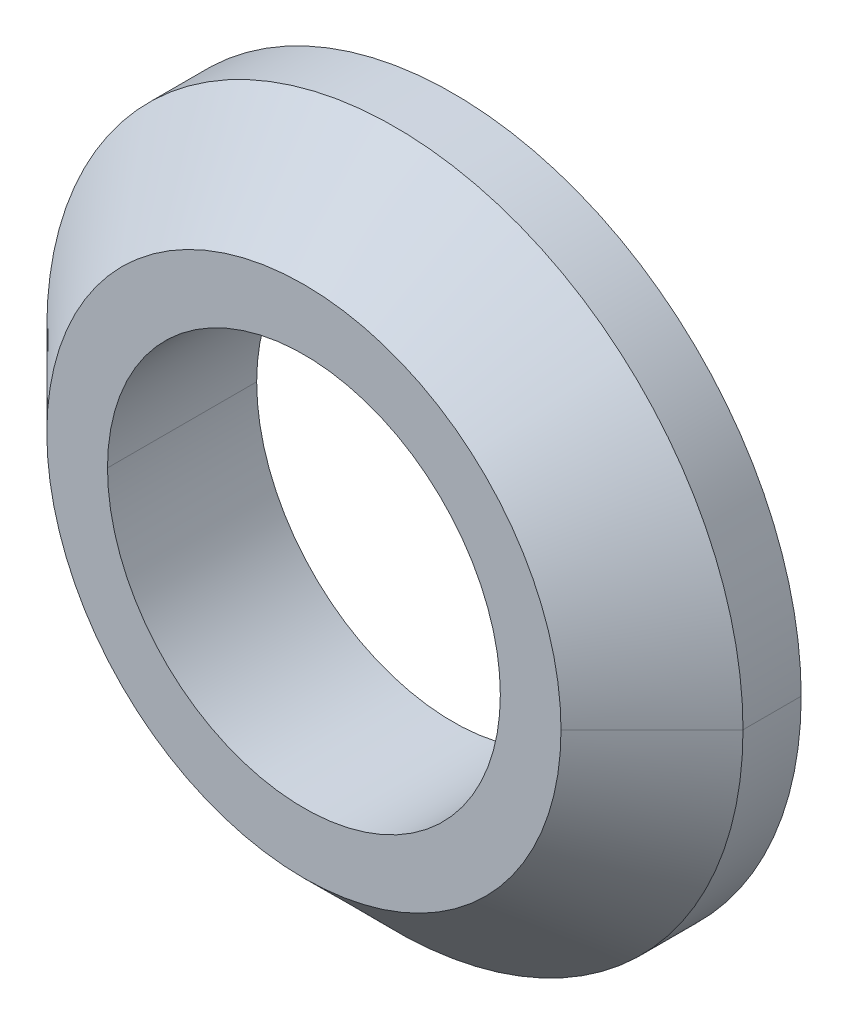
ISO-10303-21;
HEADER;
FILE_DESCRIPTION(('STEP AP214'),'2;1');
FILE_NAME('part.step','',(''),(''),'','','');
FILE_SCHEMA(('AUTOMOTIVE_DESIGN { 1 0 10303 214 1 1 1 1 }'));
ENDSEC;
DATA;
#1=APPLICATION_CONTEXT('core data for automotive mechanical design processes');
#2=APPLICATION_PROTOCOL_DEFINITION('international standard','automotive_design',2000,#1);
#3=PRODUCT_CONTEXT('',#1,'mechanical');
#4=PRODUCT('Part','Part','',(#3));
#5=PRODUCT_RELATED_PRODUCT_CATEGORY('part','',(#4));
#6=PRODUCT_DEFINITION_FORMATION('','',#4);
#7=PRODUCT_DEFINITION_CONTEXT('part definition',#1,'design');
#8=PRODUCT_DEFINITION('design','',#6,#7);
#9=PRODUCT_DEFINITION_SHAPE('','',#8);
#10=(LENGTH_UNIT() NAMED_UNIT(*) SI_UNIT(.MILLI.,.METRE.));
#11=(NAMED_UNIT(*) PLANE_ANGLE_UNIT() SI_UNIT($,.RADIAN.));
#12=(NAMED_UNIT(*) SI_UNIT($,.STERADIAN.) SOLID_ANGLE_UNIT());
#13=UNCERTAINTY_MEASURE_WITH_UNIT(LENGTH_MEASURE(1.E-05),#10,'distance_accuracy_value','');
#14=(GEOMETRIC_REPRESENTATION_CONTEXT(3) GLOBAL_UNCERTAINTY_ASSIGNED_CONTEXT((#13)) GLOBAL_UNIT_ASSIGNED_CONTEXT((#10,
#11,#12)) REPRESENTATION_CONTEXT('',''));
#15=CARTESIAN_POINT('',(0.,0.,0.));
#16=DIRECTION('',(0.,0.,1.));
#17=DIRECTION('',(1.,0.,0.));
#18=AXIS2_PLACEMENT_3D('',#15,#16,#17);
#19=CARTESIAN_POINT('',(0.,0.,0.));
#20=DIRECTION('',(0.,0.,-1.));
#21=DIRECTION('',(-1.,0.,0.));
#22=AXIS2_PLACEMENT_3D('',#19,#20,#21);
#23=CYLINDRICAL_SURFACE('',#22,3.5);
#24=CARTESIAN_POINT('',(0.,0.,0.585));
#25=DIRECTION('',(0.,0.,-1.));
#26=DIRECTION('',(-1.,0.,0.));
#27=AXIS2_PLACEMENT_3D('',#24,#25,#26);
#28=CIRCLE('',#27,3.5);
#29=CARTESIAN_POINT('',(-3.5,0.,0.585));
#30=VERTEX_POINT('',#29);
#31=CARTESIAN_POINT('',(3.5,0.,0.585));
#32=VERTEX_POINT('',#31);
#33=EDGE_CURVE('E11',#30,#32,#28,.T.);
#34=ORIENTED_EDGE('',*,*,#33,.T.);
#35=DIRECTION('',(0.,0.,-1.));
#36=VECTOR('',#35,1.);
#37=CARTESIAN_POINT('',(3.5,0.,0.));
#38=LINE('',#37,#36);
#39=CARTESIAN_POINT('',(3.5,0.,0.));
#40=VERTEX_POINT('',#39);
#41=EDGE_CURVE('E27',#32,#40,#38,.T.);
#42=ORIENTED_EDGE('',*,*,#41,.T.);
#43=CARTESIAN_POINT('',(0.,0.,0.));
#44=DIRECTION('',(0.,0.,-1.));
#45=DIRECTION('',(-1.,0.,0.));
#46=AXIS2_PLACEMENT_3D('',#43,#44,#45);
#47=CIRCLE('',#46,3.5);
#48=CARTESIAN_POINT('',(-3.5,0.,0.));
#49=VERTEX_POINT('',#48);
#50=EDGE_CURVE('E128',#49,#40,#47,.T.);
#51=ORIENTED_EDGE('',*,*,#50,.F.);
#52=DIRECTION('',(0.,0.,-1.));
#53=VECTOR('',#52,1.);
#54=CARTESIAN_POINT('',(-3.5,0.,0.));
#55=LINE('',#54,#53);
#56=EDGE_CURVE('E78',#30,#49,#55,.T.);
#57=ORIENTED_EDGE('',*,*,#56,.F.);
#58=EDGE_LOOP('',(#34,#42,#51,#57));
#59=FACE_BOUND('',#58,.T.);
#60=ADVANCED_FACE('F16',(#59),#23,.T.);
#61=CARTESIAN_POINT('',(0.,0.,0.585));
#62=DIRECTION('',(0.,0.,-1.));
#63=DIRECTION('',(-1.,0.,0.));
#64=AXIS2_PLACEMENT_3D('',#61,#62,#63);
#65=CONICAL_SURFACE('',#64,3.5,0.785398163397446);
#66=CARTESIAN_POINT('',(0.,0.,1.5));
#67=DIRECTION('',(0.,0.,-1.));
#68=DIRECTION('',(-1.,0.,0.));
#69=AXIS2_PLACEMENT_3D('',#66,#67,#68);
#70=CIRCLE('',#69,2.585);
#71=CARTESIAN_POINT('',(-2.585,0.,1.5));
#72=VERTEX_POINT('',#71);
#73=CARTESIAN_POINT('',(2.585,0.,1.5));
#74=VERTEX_POINT('',#73);
#75=EDGE_CURVE('E92',#72,#74,#70,.T.);
#76=ORIENTED_EDGE('',*,*,#75,.T.);
#77=DIRECTION('',(0.707106781186546,0.,-0.707106781186549));
#78=VECTOR('',#77,1.);
#79=CARTESIAN_POINT('',(3.5,0.,0.585));
#80=LINE('',#79,#78);
#81=EDGE_CURVE('E41',#74,#32,#80,.T.);
#82=ORIENTED_EDGE('',*,*,#81,.T.);
#83=ORIENTED_EDGE('',*,*,#33,.F.);
#84=DIRECTION('',(-0.707106781186546,0.,-0.707106781186549));
#85=VECTOR('',#84,1.);
#86=CARTESIAN_POINT('',(-3.5,0.,0.585));
#87=LINE('',#86,#85);
#88=EDGE_CURVE('E97',#72,#30,#87,.T.);
#89=ORIENTED_EDGE('',*,*,#88,.F.);
#90=EDGE_LOOP('',(#76,#82,#83,#89));
#91=FACE_BOUND('',#90,.T.);
#92=ADVANCED_FACE('F96',(#91),#65,.T.);
#93=CARTESIAN_POINT('',(0.,0.,0.));
#94=DIRECTION('',(0.,0.,-1.));
#95=DIRECTION('',(-1.,0.,0.));
#96=AXIS2_PLACEMENT_3D('',#93,#94,#95);
#97=CYLINDRICAL_SURFACE('',#96,1.975);
#98=CARTESIAN_POINT('',(0.,0.,1.5));
#99=DIRECTION('',(0.,0.,-1.));
#100=DIRECTION('',(-1.,0.,0.));
#101=AXIS2_PLACEMENT_3D('',#98,#99,#100);
#102=CIRCLE('',#101,1.975);
#103=CARTESIAN_POINT('',(1.975,0.,1.5));
#104=VERTEX_POINT('',#103);
#105=CARTESIAN_POINT('',(-1.975,0.,1.5));
#106=VERTEX_POINT('',#105);
#107=EDGE_CURVE('E104',#104,#106,#102,.T.);
#108=ORIENTED_EDGE('',*,*,#107,.F.);
#109=DIRECTION('',(0.,0.,-1.));
#110=VECTOR('',#109,1.);
#111=CARTESIAN_POINT('',(1.975,0.,0.));
#112=LINE('',#111,#110);
#113=CARTESIAN_POINT('',(1.975,0.,0.));
#114=VERTEX_POINT('',#113);
#115=EDGE_CURVE('E93',#104,#114,#112,.T.);
#116=ORIENTED_EDGE('',*,*,#115,.T.);
#117=CARTESIAN_POINT('',(0.,0.,0.));
#118=DIRECTION('',(0.,0.,-1.));
#119=DIRECTION('',(-1.,0.,0.));
#120=AXIS2_PLACEMENT_3D('',#117,#118,#119);
#121=CIRCLE('',#120,1.975);
#122=CARTESIAN_POINT('',(-1.975,0.,0.));
#123=VERTEX_POINT('',#122);
#124=EDGE_CURVE('E130',#114,#123,#121,.T.);
#125=ORIENTED_EDGE('',*,*,#124,.T.);
#126=DIRECTION('',(0.,0.,-1.));
#127=VECTOR('',#126,1.);
#128=CARTESIAN_POINT('',(-1.975,0.,0.));
#129=LINE('',#128,#127);
#130=EDGE_CURVE('E120',#106,#123,#129,.T.);
#131=ORIENTED_EDGE('',*,*,#130,.F.);
#132=EDGE_LOOP('',(#108,#116,#125,#131));
#133=FACE_BOUND('',#132,.T.);
#134=ADVANCED_FACE('F192',(#133),#97,.F.);
#135=CARTESIAN_POINT('',(0.,0.,0.));
#136=DIRECTION('',(0.,0.,-1.));
#137=DIRECTION('',(0.,-1.,0.));
#138=AXIS2_PLACEMENT_3D('',#135,#136,#137);
#139=PLANE('',#138);
#140=ORIENTED_EDGE('',*,*,#50,.T.);
#141=CARTESIAN_POINT('',(0.,0.,0.));
#142=DIRECTION('',(0.,0.,-1.));
#143=DIRECTION('',(-1.,0.,0.));
#144=AXIS2_PLACEMENT_3D('',#141,#142,#143);
#145=CIRCLE('',#144,3.5);
#146=EDGE_CURVE('E20',#40,#49,#145,.T.);
#147=ORIENTED_EDGE('',*,*,#146,.T.);
#148=EDGE_LOOP('',(#140,#147));
#149=FACE_BOUND('',#148,.T.);
#150=CARTESIAN_POINT('',(0.,0.,0.));
#151=DIRECTION('',(0.,0.,-1.));
#152=DIRECTION('',(-1.,0.,0.));
#153=AXIS2_PLACEMENT_3D('',#150,#151,#152);
#154=CIRCLE('',#153,1.975);
#155=EDGE_CURVE('E119',#123,#114,#154,.T.);
#156=ORIENTED_EDGE('',*,*,#155,.F.);
#157=ORIENTED_EDGE('',*,*,#124,.F.);
#158=EDGE_LOOP('',(#156,#157));
#159=FACE_BOUND('',#158,.T.);
#160=ADVANCED_FACE('F18',(#149,#159),#139,.T.);
#161=CARTESIAN_POINT('',(0.,0.,0.));
#162=DIRECTION('',(0.,0.,-1.));
#163=DIRECTION('',(-1.,0.,0.));
#164=AXIS2_PLACEMENT_3D('',#161,#162,#163);
#165=CYLINDRICAL_SURFACE('',#164,1.975);
#166=ORIENTED_EDGE('',*,*,#115,.F.);
#167=CARTESIAN_POINT('',(0.,0.,1.5));
#168=DIRECTION('',(0.,0.,-1.));
#169=DIRECTION('',(-1.,0.,0.));
#170=AXIS2_PLACEMENT_3D('',#167,#168,#169);
#171=CIRCLE('',#170,1.975);
#172=EDGE_CURVE('E110',#106,#104,#171,.T.);
#173=ORIENTED_EDGE('',*,*,#172,.F.);
#174=ORIENTED_EDGE('',*,*,#130,.T.);
#175=ORIENTED_EDGE('',*,*,#155,.T.);
#176=EDGE_LOOP('',(#166,#173,#174,#175));
#177=FACE_BOUND('',#176,.T.);
#178=ADVANCED_FACE('F163',(#177),#165,.F.);
#179=CARTESIAN_POINT('',(0.,0.,1.5));
#180=DIRECTION('',(0.,0.,1.));
#181=DIRECTION('',(1.,0.,0.));
#182=AXIS2_PLACEMENT_3D('',#179,#180,#181);
#183=PLANE('',#182);
#184=ORIENTED_EDGE('',*,*,#75,.F.);
#185=CARTESIAN_POINT('',(0.,0.,1.5));
#186=DIRECTION('',(0.,0.,-1.));
#187=DIRECTION('',(-1.,0.,0.));
#188=AXIS2_PLACEMENT_3D('',#185,#186,#187);
#189=CIRCLE('',#188,2.585);
#190=EDGE_CURVE('E88',#74,#72,#189,.T.);
#191=ORIENTED_EDGE('',*,*,#190,.F.);
#192=EDGE_LOOP('',(#184,#191));
#193=FACE_BOUND('',#192,.T.);
#194=ORIENTED_EDGE('',*,*,#172,.T.);
#195=ORIENTED_EDGE('',*,*,#107,.T.);
#196=EDGE_LOOP('',(#194,#195));
#197=FACE_BOUND('',#196,.T.);
#198=ADVANCED_FACE('F101',(#193,#197),#183,.T.);
#199=CARTESIAN_POINT('',(0.,0.,0.585));
#200=DIRECTION('',(0.,0.,-1.));
#201=DIRECTION('',(-1.,0.,0.));
#202=AXIS2_PLACEMENT_3D('',#199,#200,#201);
#203=CONICAL_SURFACE('',#202,3.5,0.785398163397446);
#204=ORIENTED_EDGE('',*,*,#81,.F.);
#205=ORIENTED_EDGE('',*,*,#190,.T.);
#206=ORIENTED_EDGE('',*,*,#88,.T.);
#207=CARTESIAN_POINT('',(0.,0.,0.585));
#208=DIRECTION('',(0.,0.,-1.));
#209=DIRECTION('',(-1.,0.,0.));
#210=AXIS2_PLACEMENT_3D('',#207,#208,#209);
#211=CIRCLE('',#210,3.5);
#212=EDGE_CURVE('E90',#32,#30,#211,.T.);
#213=ORIENTED_EDGE('',*,*,#212,.F.);
#214=EDGE_LOOP('',(#204,#205,#206,#213));
#215=FACE_BOUND('',#214,.T.);
#216=ADVANCED_FACE('F86',(#215),#203,.T.);
#217=CARTESIAN_POINT('',(0.,0.,0.));
#218=DIRECTION('',(0.,0.,-1.));
#219=DIRECTION('',(-1.,0.,0.));
#220=AXIS2_PLACEMENT_3D('',#217,#218,#219);
#221=CYLINDRICAL_SURFACE('',#220,3.5);
#222=ORIENTED_EDGE('',*,*,#41,.F.);
#223=ORIENTED_EDGE('',*,*,#212,.T.);
#224=ORIENTED_EDGE('',*,*,#56,.T.);
#225=ORIENTED_EDGE('',*,*,#146,.F.);
#226=EDGE_LOOP('',(#222,#223,#224,#225));
#227=FACE_BOUND('',#226,.T.);
#228=ADVANCED_FACE('F153',(#227),#221,.T.);
#229=CLOSED_SHELL('',(#60,#92,#134,#160,#178,#198,#216,#228));
#230=MANIFOLD_SOLID_BREP('B1',#229);
#231=ADVANCED_BREP_SHAPE_REPRESENTATION('',(#18,#230),#14);
#232=SHAPE_DEFINITION_REPRESENTATION(#9,#231);
ENDSEC;
END-ISO-10303-21;
